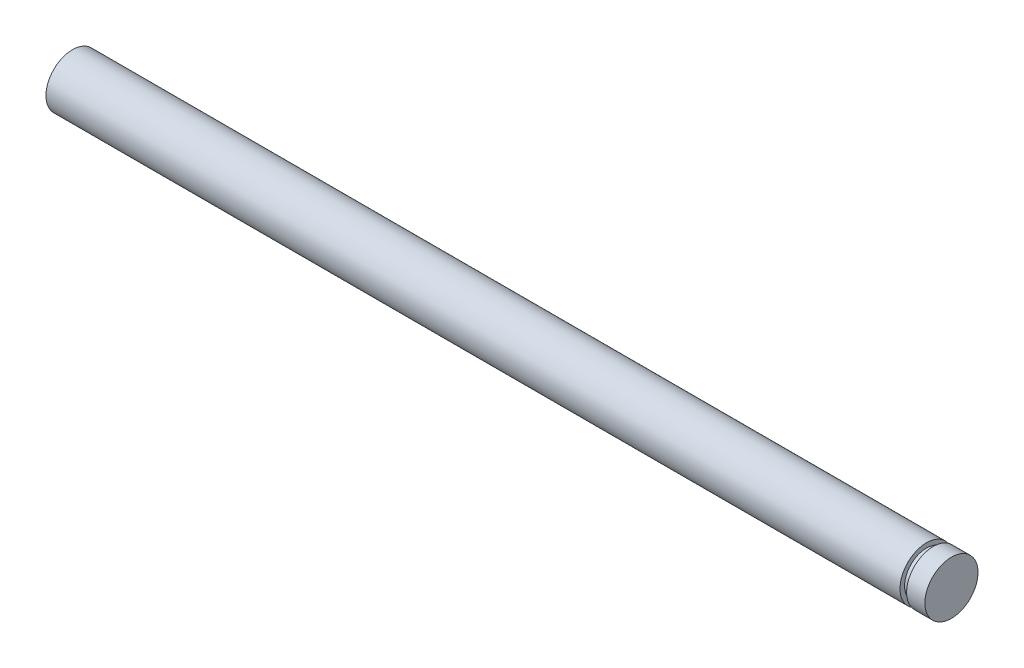
ISO-10303-21;
HEADER;
FILE_DESCRIPTION(('STEP AP214'),'2;1');
FILE_NAME('part.step','',(''),(''),'','','');
FILE_SCHEMA(('AUTOMOTIVE_DESIGN { 1 0 10303 214 1 1 1 1 }'));
ENDSEC;
DATA;
#1=APPLICATION_CONTEXT('core data for automotive mechanical design processes');
#2=APPLICATION_PROTOCOL_DEFINITION('international standard','automotive_design',2000,#1);
#3=PRODUCT_CONTEXT('',#1,'mechanical');
#4=PRODUCT('Part','Part','',(#3));
#5=PRODUCT_RELATED_PRODUCT_CATEGORY('part','',(#4));
#6=PRODUCT_DEFINITION_FORMATION('','',#4);
#7=PRODUCT_DEFINITION_CONTEXT('part definition',#1,'design');
#8=PRODUCT_DEFINITION('design','',#6,#7);
#9=PRODUCT_DEFINITION_SHAPE('','',#8);
#10=(LENGTH_UNIT() NAMED_UNIT(*) SI_UNIT(.MILLI.,.METRE.));
#11=(NAMED_UNIT(*) PLANE_ANGLE_UNIT() SI_UNIT($,.RADIAN.));
#12=(NAMED_UNIT(*) SI_UNIT($,.STERADIAN.) SOLID_ANGLE_UNIT());
#13=UNCERTAINTY_MEASURE_WITH_UNIT(LENGTH_MEASURE(1.E-05),#10,'distance_accuracy_value','');
#14=(GEOMETRIC_REPRESENTATION_CONTEXT(3) GLOBAL_UNCERTAINTY_ASSIGNED_CONTEXT((#13)) GLOBAL_UNIT_ASSIGNED_CONTEXT((#10,
#11,#12)) REPRESENTATION_CONTEXT('',''));
#15=CARTESIAN_POINT('',(0.,0.,0.));
#16=DIRECTION('',(0.,0.,1.));
#17=DIRECTION('',(1.,0.,0.));
#18=AXIS2_PLACEMENT_3D('',#15,#16,#17);
#19=CARTESIAN_POINT('',(0.,0.,0.));
#20=DIRECTION('',(-1.,0.,0.));
#21=DIRECTION('',(0.,0.,1.));
#22=AXIS2_PLACEMENT_3D('',#19,#20,#21);
#23=PLANE('',#22);
#24=CARTESIAN_POINT('',(0.,0.,0.));
#25=DIRECTION('',(1.,0.,0.));
#26=DIRECTION('',(0.,0.,-1.));
#27=AXIS2_PLACEMENT_3D('',#24,#25,#26);
#28=CIRCLE('',#27,0.725);
#29=CARTESIAN_POINT('',(0.,0.,-0.725));
#30=VERTEX_POINT('',#29);
#31=EDGE_CURVE('E10',#30,#30,#28,.T.);
#32=ORIENTED_EDGE('',*,*,#31,.F.);
#33=EDGE_LOOP('',(#32));
#34=FACE_BOUND('',#33,.T.);
#35=ADVANCED_FACE('F35',(#34),#23,.T.);
#36=CARTESIAN_POINT('',(24.,0.,0.));
#37=DIRECTION('',(1.,0.,0.));
#38=DIRECTION('',(0.,0.,-1.));
#39=AXIS2_PLACEMENT_3D('',#36,#37,#38);
#40=CYLINDRICAL_SURFACE('',#39,0.725);
#41=ORIENTED_EDGE('',*,*,#31,.T.);
#42=EDGE_LOOP('',(#41));
#43=FACE_BOUND('',#42,.T.);
#44=CARTESIAN_POINT('',(23.32,0.,0.));
#45=DIRECTION('',(1.,0.,0.));
#46=DIRECTION('',(0.,0.,-1.));
#47=AXIS2_PLACEMENT_3D('',#44,#45,#46);
#48=CIRCLE('',#47,0.725);
#49=CARTESIAN_POINT('',(23.32,0.,-0.725));
#50=VERTEX_POINT('',#49);
#51=EDGE_CURVE('E41',#50,#50,#48,.T.);
#52=ORIENTED_EDGE('',*,*,#51,.F.);
#53=EDGE_LOOP('',(#52));
#54=FACE_BOUND('',#53,.T.);
#55=ADVANCED_FACE('F77',(#43,#54),#40,.T.);
#56=CARTESIAN_POINT('',(23.32,0.725,0.));
#57=DIRECTION('',(1.,0.,0.));
#58=DIRECTION('',(0.,0.,-1.));
#59=AXIS2_PLACEMENT_3D('',#56,#57,#58);
#60=PLANE('',#59);
#61=ORIENTED_EDGE('',*,*,#51,.T.);
#62=EDGE_LOOP('',(#61));
#63=FACE_BOUND('',#62,.T.);
#64=CARTESIAN_POINT('',(23.32,0.,0.));
#65=DIRECTION('',(1.,0.,0.));
#66=DIRECTION('',(0.,0.,-1.));
#67=AXIS2_PLACEMENT_3D('',#64,#65,#66);
#68=CIRCLE('',#67,0.6);
#69=CARTESIAN_POINT('',(23.32,0.,-0.6));
#70=VERTEX_POINT('',#69);
#71=EDGE_CURVE('E45',#70,#70,#68,.T.);
#72=ORIENTED_EDGE('',*,*,#71,.F.);
#73=EDGE_LOOP('',(#72));
#74=FACE_BOUND('',#73,.T.);
#75=ADVANCED_FACE('F82',(#63,#74),#60,.T.);
#76=CARTESIAN_POINT('',(24.,0.,0.));
#77=DIRECTION('',(1.,0.,0.));
#78=DIRECTION('',(0.,0.,-1.));
#79=AXIS2_PLACEMENT_3D('',#76,#77,#78);
#80=CYLINDRICAL_SURFACE('',#79,0.6);
#81=ORIENTED_EDGE('',*,*,#71,.T.);
#82=EDGE_LOOP('',(#81));
#83=FACE_BOUND('',#82,.T.);
#84=CARTESIAN_POINT('',(23.5,0.,0.));
#85=DIRECTION('',(1.,0.,0.));
#86=DIRECTION('',(0.,0.,-1.));
#87=AXIS2_PLACEMENT_3D('',#84,#85,#86);
#88=CIRCLE('',#87,0.6);
#89=CARTESIAN_POINT('',(23.5,0.,-0.6));
#90=VERTEX_POINT('',#89);
#91=EDGE_CURVE('E49',#90,#90,#88,.T.);
#92=ORIENTED_EDGE('',*,*,#91,.F.);
#93=EDGE_LOOP('',(#92));
#94=FACE_BOUND('',#93,.T.);
#95=ADVANCED_FACE('F73',(#83,#94),#80,.T.);
#96=CARTESIAN_POINT('',(23.5,0.6,0.));
#97=DIRECTION('',(-1.,0.,0.));
#98=DIRECTION('',(0.,0.,1.));
#99=AXIS2_PLACEMENT_3D('',#96,#97,#98);
#100=PLANE('',#99);
#101=ORIENTED_EDGE('',*,*,#91,.T.);
#102=EDGE_LOOP('',(#101));
#103=FACE_BOUND('',#102,.T.);
#104=CARTESIAN_POINT('',(23.5,0.,0.));
#105=DIRECTION('',(1.,0.,0.));
#106=DIRECTION('',(0.,0.,-1.));
#107=AXIS2_PLACEMENT_3D('',#104,#105,#106);
#108=CIRCLE('',#107,0.725);
#109=CARTESIAN_POINT('',(23.5,0.,-0.725));
#110=VERTEX_POINT('',#109);
#111=EDGE_CURVE('E54',#110,#110,#108,.T.);
#112=ORIENTED_EDGE('',*,*,#111,.F.);
#113=EDGE_LOOP('',(#112));
#114=FACE_BOUND('',#113,.T.);
#115=ADVANCED_FACE('F65',(#103,#114),#100,.T.);
#116=CARTESIAN_POINT('',(24.,0.,0.));
#117=DIRECTION('',(1.,0.,0.));
#118=DIRECTION('',(0.,0.,-1.));
#119=AXIS2_PLACEMENT_3D('',#116,#117,#118);
#120=CYLINDRICAL_SURFACE('',#119,0.725);
#121=ORIENTED_EDGE('',*,*,#111,.T.);
#122=EDGE_LOOP('',(#121));
#123=FACE_BOUND('',#122,.T.);
#124=CARTESIAN_POINT('',(24.,0.,0.));
#125=DIRECTION('',(1.,0.,0.));
#126=DIRECTION('',(0.,0.,-1.));
#127=AXIS2_PLACEMENT_3D('',#124,#125,#126);
#128=CIRCLE('',#127,0.725);
#129=CARTESIAN_POINT('',(24.,0.,-0.725));
#130=VERTEX_POINT('',#129);
#131=EDGE_CURVE('E57',#130,#130,#128,.T.);
#132=ORIENTED_EDGE('',*,*,#131,.F.);
#133=EDGE_LOOP('',(#132));
#134=FACE_BOUND('',#133,.T.);
#135=ADVANCED_FACE('F63',(#123,#134),#120,.T.);
#136=CARTESIAN_POINT('',(24.,0.725,0.));
#137=DIRECTION('',(1.,0.,0.));
#138=DIRECTION('',(0.,0.,-1.));
#139=AXIS2_PLACEMENT_3D('',#136,#137,#138);
#140=PLANE('',#139);
#141=ORIENTED_EDGE('',*,*,#131,.T.);
#142=EDGE_LOOP('',(#141));
#143=FACE_BOUND('',#142,.T.);
#144=ADVANCED_FACE('F61',(#143),#140,.T.);
#145=CLOSED_SHELL('',(#35,#55,#75,#95,#115,#135,#144));
#146=MANIFOLD_SOLID_BREP('B2',#145);
#147=ADVANCED_BREP_SHAPE_REPRESENTATION('',(#18,#146),#14);
#148=SHAPE_DEFINITION_REPRESENTATION(#9,#147);
ENDSEC;
END-ISO-10303-21;
